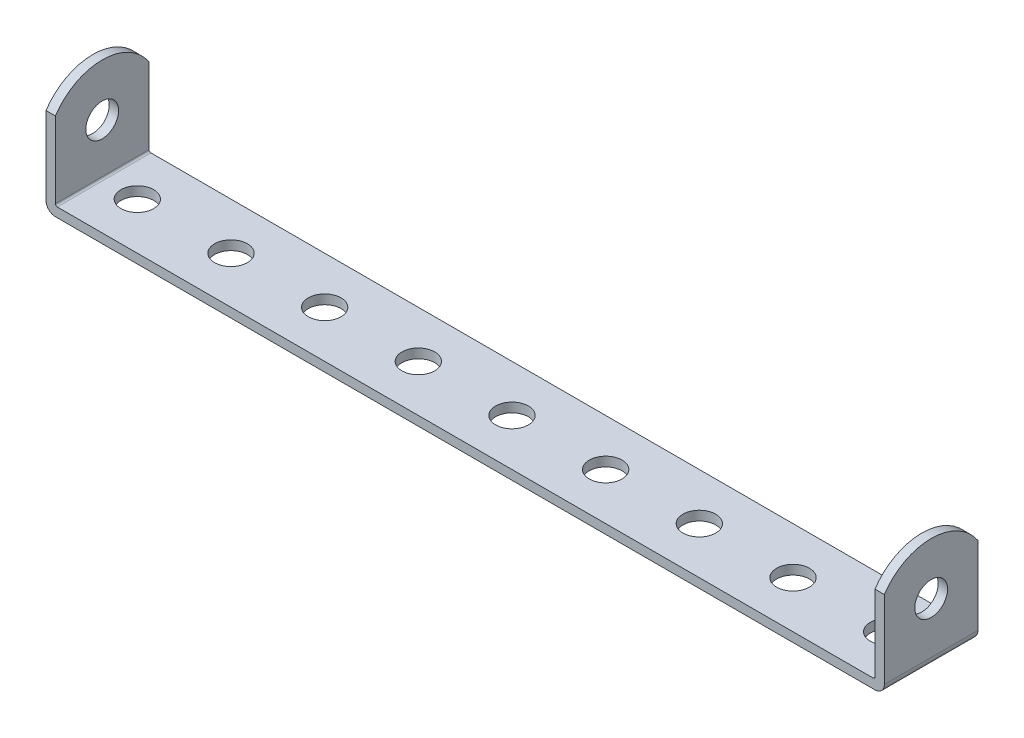
ISO-10303-21;
HEADER;
FILE_DESCRIPTION(('STEP AP214'),'2;1');
FILE_NAME('part.step','',(''),(''),'','','');
FILE_SCHEMA(('AUTOMOTIVE_DESIGN { 1 0 10303 214 1 1 1 1 }'));
ENDSEC;
DATA;
#1=APPLICATION_CONTEXT('core data for automotive mechanical design processes');
#2=APPLICATION_PROTOCOL_DEFINITION('international standard','automotive_design',2000,#1);
#3=PRODUCT_CONTEXT('',#1,'mechanical');
#4=PRODUCT('Part','Part','',(#3));
#5=PRODUCT_RELATED_PRODUCT_CATEGORY('part','',(#4));
#6=PRODUCT_DEFINITION_FORMATION('','',#4);
#7=PRODUCT_DEFINITION_CONTEXT('part definition',#1,'design');
#8=PRODUCT_DEFINITION('design','',#6,#7);
#9=PRODUCT_DEFINITION_SHAPE('','',#8);
#10=(LENGTH_UNIT() NAMED_UNIT(*) SI_UNIT(.MILLI.,.METRE.));
#11=(NAMED_UNIT(*) PLANE_ANGLE_UNIT() SI_UNIT($,.RADIAN.));
#12=(NAMED_UNIT(*) SI_UNIT($,.STERADIAN.) SOLID_ANGLE_UNIT());
#13=UNCERTAINTY_MEASURE_WITH_UNIT(LENGTH_MEASURE(1.E-05),#10,'distance_accuracy_value','');
#14=(GEOMETRIC_REPRESENTATION_CONTEXT(3) GLOBAL_UNCERTAINTY_ASSIGNED_CONTEXT((#13)) GLOBAL_UNIT_ASSIGNED_CONTEXT((#10,
#11,#12)) REPRESENTATION_CONTEXT('',''));
#15=CARTESIAN_POINT('',(0.,0.,0.));
#16=DIRECTION('',(0.,0.,1.));
#17=DIRECTION('',(1.,0.,0.));
#18=AXIS2_PLACEMENT_3D('',#15,#16,#17);
#19=CARTESIAN_POINT('',(6.03249999999999,1.27,6.35));
#20=DIRECTION('',(0.,-1.,0.));
#21=DIRECTION('',(0.,0.,-1.));
#22=AXIS2_PLACEMENT_3D('',#19,#20,#21);
#23=CYLINDRICAL_SURFACE('',#22,2.2225);
#24=CARTESIAN_POINT('',(6.03249999999999,0.,6.35));
#25=DIRECTION('',(0.,1.,0.));
#26=DIRECTION('',(1.,0.,0.));
#27=AXIS2_PLACEMENT_3D('',#24,#25,#26);
#28=CIRCLE('',#27,2.2225);
#29=CARTESIAN_POINT('',(8.25499999999999,0.,6.35));
#30=VERTEX_POINT('',#29);
#31=EDGE_CURVE('E201',#30,#30,#28,.T.);
#32=ORIENTED_EDGE('',*,*,#31,.F.);
#33=EDGE_LOOP('',(#32));
#34=FACE_BOUND('',#33,.T.);
#35=CARTESIAN_POINT('',(6.03249999999999,1.27,6.35));
#36=DIRECTION('',(0.,-1.,0.));
#37=DIRECTION('',(0.,0.,-1.));
#38=AXIS2_PLACEMENT_3D('',#35,#36,#37);
#39=CIRCLE('',#38,2.2225);
#40=CARTESIAN_POINT('',(6.03249999999999,1.27,4.1275));
#41=VERTEX_POINT('',#40);
#42=EDGE_CURVE('E195',#41,#41,#39,.T.);
#43=ORIENTED_EDGE('',*,*,#42,.F.);
#44=EDGE_LOOP('',(#43));
#45=FACE_BOUND('',#44,.T.);
#46=ADVANCED_FACE('F16',(#34,#45),#23,.F.);
#47=CARTESIAN_POINT('',(82.2325,1.27000000000001,6.35));
#48=DIRECTION('',(0.,-1.,0.));
#49=DIRECTION('',(0.,0.,-1.));
#50=AXIS2_PLACEMENT_3D('',#47,#48,#49);
#51=CYLINDRICAL_SURFACE('',#50,2.2225);
#52=CARTESIAN_POINT('',(82.2325,0.,6.35));
#53=DIRECTION('',(0.,1.,0.));
#54=DIRECTION('',(1.,0.,0.));
#55=AXIS2_PLACEMENT_3D('',#52,#53,#54);
#56=CIRCLE('',#55,2.2225);
#57=CARTESIAN_POINT('',(84.455,0.,6.35));
#58=VERTEX_POINT('',#57);
#59=EDGE_CURVE('E555',#58,#58,#56,.T.);
#60=ORIENTED_EDGE('',*,*,#59,.F.);
#61=EDGE_LOOP('',(#60));
#62=FACE_BOUND('',#61,.T.);
#63=CARTESIAN_POINT('',(82.2325,1.27,6.35));
#64=DIRECTION('',(0.,-1.,0.));
#65=DIRECTION('',(0.,0.,-1.));
#66=AXIS2_PLACEMENT_3D('',#63,#64,#65);
#67=CIRCLE('',#66,2.2225);
#68=CARTESIAN_POINT('',(82.2325,1.27,4.1275));
#69=VERTEX_POINT('',#68);
#70=EDGE_CURVE('E499',#69,#69,#67,.T.);
#71=ORIENTED_EDGE('',*,*,#70,.F.);
#72=EDGE_LOOP('',(#71));
#73=FACE_BOUND('',#72,.T.);
#74=ADVANCED_FACE('F270',(#62,#73),#51,.F.);
#75=CARTESIAN_POINT('',(18.7325,1.27,6.35));
#76=DIRECTION('',(0.,-1.,0.));
#77=DIRECTION('',(0.,0.,-1.));
#78=AXIS2_PLACEMENT_3D('',#75,#76,#77);
#79=CYLINDRICAL_SURFACE('',#78,2.2225);
#80=CARTESIAN_POINT('',(18.7325,0.,6.35));
#81=DIRECTION('',(0.,1.,0.));
#82=DIRECTION('',(1.,0.,0.));
#83=AXIS2_PLACEMENT_3D('',#80,#81,#82);
#84=CIRCLE('',#83,2.2225);
#85=CARTESIAN_POINT('',(20.955,0.,6.35));
#86=VERTEX_POINT('',#85);
#87=EDGE_CURVE('E551',#86,#86,#84,.T.);
#88=ORIENTED_EDGE('',*,*,#87,.F.);
#89=EDGE_LOOP('',(#88));
#90=FACE_BOUND('',#89,.T.);
#91=CARTESIAN_POINT('',(18.7325,1.27,6.35));
#92=DIRECTION('',(0.,-1.,0.));
#93=DIRECTION('',(0.,0.,-1.));
#94=AXIS2_PLACEMENT_3D('',#91,#92,#93);
#95=CIRCLE('',#94,2.2225);
#96=CARTESIAN_POINT('',(18.7325,1.27,4.1275));
#97=VERTEX_POINT('',#96);
#98=EDGE_CURVE('E503',#97,#97,#95,.T.);
#99=ORIENTED_EDGE('',*,*,#98,.F.);
#100=EDGE_LOOP('',(#99));
#101=FACE_BOUND('',#100,.T.);
#102=ADVANCED_FACE('F276',(#90,#101),#79,.F.);
#103=CARTESIAN_POINT('',(44.1325,1.27000000000001,6.35));
#104=DIRECTION('',(0.,-1.,0.));
#105=DIRECTION('',(0.,0.,-1.));
#106=AXIS2_PLACEMENT_3D('',#103,#104,#105);
#107=CYLINDRICAL_SURFACE('',#106,2.2225);
#108=CARTESIAN_POINT('',(44.1325,0.,6.35));
#109=DIRECTION('',(0.,1.,0.));
#110=DIRECTION('',(1.,0.,0.));
#111=AXIS2_PLACEMENT_3D('',#108,#109,#110);
#112=CIRCLE('',#111,2.2225);
#113=CARTESIAN_POINT('',(46.355,0.,6.35));
#114=VERTEX_POINT('',#113);
#115=EDGE_CURVE('E547',#114,#114,#112,.T.);
#116=ORIENTED_EDGE('',*,*,#115,.F.);
#117=EDGE_LOOP('',(#116));
#118=FACE_BOUND('',#117,.T.);
#119=CARTESIAN_POINT('',(44.1325,1.27,6.35));
#120=DIRECTION('',(0.,-1.,0.));
#121=DIRECTION('',(0.,0.,-1.));
#122=AXIS2_PLACEMENT_3D('',#119,#120,#121);
#123=CIRCLE('',#122,2.2225);
#124=CARTESIAN_POINT('',(44.1325,1.27,4.1275));
#125=VERTEX_POINT('',#124);
#126=EDGE_CURVE('E507',#125,#125,#123,.T.);
#127=ORIENTED_EDGE('',*,*,#126,.F.);
#128=EDGE_LOOP('',(#127));
#129=FACE_BOUND('',#128,.T.);
#130=ADVANCED_FACE('F285',(#118,#129),#107,.F.);
#131=CARTESIAN_POINT('',(56.8325,1.27000000000001,6.35));
#132=DIRECTION('',(0.,-1.,0.));
#133=DIRECTION('',(0.,0.,-1.));
#134=AXIS2_PLACEMENT_3D('',#131,#132,#133);
#135=CYLINDRICAL_SURFACE('',#134,2.2225);
#136=CARTESIAN_POINT('',(56.8325,0.,6.35));
#137=DIRECTION('',(0.,1.,0.));
#138=DIRECTION('',(1.,0.,0.));
#139=AXIS2_PLACEMENT_3D('',#136,#137,#138);
#140=CIRCLE('',#139,2.2225);
#141=CARTESIAN_POINT('',(59.055,0.,6.35));
#142=VERTEX_POINT('',#141);
#143=EDGE_CURVE('E543',#142,#142,#140,.T.);
#144=ORIENTED_EDGE('',*,*,#143,.F.);
#145=EDGE_LOOP('',(#144));
#146=FACE_BOUND('',#145,.T.);
#147=CARTESIAN_POINT('',(56.8325,1.27,6.35));
#148=DIRECTION('',(0.,-1.,0.));
#149=DIRECTION('',(0.,0.,-1.));
#150=AXIS2_PLACEMENT_3D('',#147,#148,#149);
#151=CIRCLE('',#150,2.2225);
#152=CARTESIAN_POINT('',(56.8325,1.27,4.1275));
#153=VERTEX_POINT('',#152);
#154=EDGE_CURVE('E511',#153,#153,#151,.T.);
#155=ORIENTED_EDGE('',*,*,#154,.F.);
#156=EDGE_LOOP('',(#155));
#157=FACE_BOUND('',#156,.T.);
#158=ADVANCED_FACE('F290',(#146,#157),#135,.F.);
#159=CARTESIAN_POINT('',(31.4325,1.27,6.35));
#160=DIRECTION('',(0.,-1.,0.));
#161=DIRECTION('',(0.,0.,-1.));
#162=AXIS2_PLACEMENT_3D('',#159,#160,#161);
#163=CYLINDRICAL_SURFACE('',#162,2.2225);
#164=CARTESIAN_POINT('',(31.4325,0.,6.35));
#165=DIRECTION('',(0.,1.,0.));
#166=DIRECTION('',(1.,0.,0.));
#167=AXIS2_PLACEMENT_3D('',#164,#165,#166);
#168=CIRCLE('',#167,2.2225);
#169=CARTESIAN_POINT('',(33.655,0.,6.35));
#170=VERTEX_POINT('',#169);
#171=EDGE_CURVE('E539',#170,#170,#168,.T.);
#172=ORIENTED_EDGE('',*,*,#171,.F.);
#173=EDGE_LOOP('',(#172));
#174=FACE_BOUND('',#173,.T.);
#175=CARTESIAN_POINT('',(31.4325,1.27,6.35));
#176=DIRECTION('',(0.,-1.,0.));
#177=DIRECTION('',(0.,0.,-1.));
#178=AXIS2_PLACEMENT_3D('',#175,#176,#177);
#179=CIRCLE('',#178,2.2225);
#180=CARTESIAN_POINT('',(31.4325,1.27,4.1275));
#181=VERTEX_POINT('',#180);
#182=EDGE_CURVE('E515',#181,#181,#179,.T.);
#183=ORIENTED_EDGE('',*,*,#182,.F.);
#184=EDGE_LOOP('',(#183));
#185=FACE_BOUND('',#184,.T.);
#186=ADVANCED_FACE('F294',(#174,#185),#163,.F.);
#187=CARTESIAN_POINT('',(69.5325,1.27000000000001,6.35));
#188=DIRECTION('',(0.,-1.,0.));
#189=DIRECTION('',(0.,0.,-1.));
#190=AXIS2_PLACEMENT_3D('',#187,#188,#189);
#191=CYLINDRICAL_SURFACE('',#190,2.2225);
#192=CARTESIAN_POINT('',(69.5325,0.,6.35));
#193=DIRECTION('',(0.,1.,0.));
#194=DIRECTION('',(1.,0.,0.));
#195=AXIS2_PLACEMENT_3D('',#192,#193,#194);
#196=CIRCLE('',#195,2.2225);
#197=CARTESIAN_POINT('',(71.755,0.,6.35));
#198=VERTEX_POINT('',#197);
#199=EDGE_CURVE('E535',#198,#198,#196,.T.);
#200=ORIENTED_EDGE('',*,*,#199,.F.);
#201=EDGE_LOOP('',(#200));
#202=FACE_BOUND('',#201,.T.);
#203=CARTESIAN_POINT('',(69.5325,1.27,6.35));
#204=DIRECTION('',(0.,-1.,0.));
#205=DIRECTION('',(0.,0.,-1.));
#206=AXIS2_PLACEMENT_3D('',#203,#204,#205);
#207=CIRCLE('',#206,2.2225);
#208=CARTESIAN_POINT('',(69.5325,1.27,4.1275));
#209=VERTEX_POINT('',#208);
#210=EDGE_CURVE('E519',#209,#209,#207,.T.);
#211=ORIENTED_EDGE('',*,*,#210,.F.);
#212=EDGE_LOOP('',(#211));
#213=FACE_BOUND('',#212,.T.);
#214=ADVANCED_FACE('F298',(#202,#213),#191,.F.);
#215=CARTESIAN_POINT('',(94.9325,1.27000000000001,6.35));
#216=DIRECTION('',(0.,-1.,0.));
#217=DIRECTION('',(0.,0.,-1.));
#218=AXIS2_PLACEMENT_3D('',#215,#216,#217);
#219=CYLINDRICAL_SURFACE('',#218,2.2225);
#220=CARTESIAN_POINT('',(94.9325,0.,6.35));
#221=DIRECTION('',(0.,1.,0.));
#222=DIRECTION('',(1.,0.,0.));
#223=AXIS2_PLACEMENT_3D('',#220,#221,#222);
#224=CIRCLE('',#223,2.2225);
#225=CARTESIAN_POINT('',(97.155,0.,6.35));
#226=VERTEX_POINT('',#225);
#227=EDGE_CURVE('E531',#226,#226,#224,.T.);
#228=ORIENTED_EDGE('',*,*,#227,.F.);
#229=EDGE_LOOP('',(#228));
#230=FACE_BOUND('',#229,.T.);
#231=CARTESIAN_POINT('',(94.9325,1.27,6.35));
#232=DIRECTION('',(0.,-1.,0.));
#233=DIRECTION('',(0.,0.,-1.));
#234=AXIS2_PLACEMENT_3D('',#231,#232,#233);
#235=CIRCLE('',#234,2.2225);
#236=CARTESIAN_POINT('',(94.9325,1.27,4.1275));
#237=VERTEX_POINT('',#236);
#238=EDGE_CURVE('E523',#237,#237,#235,.T.);
#239=ORIENTED_EDGE('',*,*,#238,.F.);
#240=EDGE_LOOP('',(#239));
#241=FACE_BOUND('',#240,.T.);
#242=ADVANCED_FACE('F302',(#230,#241),#219,.F.);
#243=CARTESIAN_POINT('',(107.6325,1.27000000000001,6.35));
#244=DIRECTION('',(0.,-1.,0.));
#245=DIRECTION('',(0.,0.,-1.));
#246=AXIS2_PLACEMENT_3D('',#243,#244,#245);
#247=CYLINDRICAL_SURFACE('',#246,2.2225);
#248=CARTESIAN_POINT('',(107.6325,0.,6.35));
#249=DIRECTION('',(0.,1.,0.));
#250=DIRECTION('',(1.,0.,0.));
#251=AXIS2_PLACEMENT_3D('',#248,#249,#250);
#252=CIRCLE('',#251,2.2225);
#253=CARTESIAN_POINT('',(109.855,0.,6.35));
#254=VERTEX_POINT('',#253);
#255=EDGE_CURVE('E186',#254,#254,#252,.T.);
#256=ORIENTED_EDGE('',*,*,#255,.F.);
#257=EDGE_LOOP('',(#256));
#258=FACE_BOUND('',#257,.T.);
#259=CARTESIAN_POINT('',(107.6325,1.27,6.35));
#260=DIRECTION('',(0.,-1.,0.));
#261=DIRECTION('',(0.,0.,-1.));
#262=AXIS2_PLACEMENT_3D('',#259,#260,#261);
#263=CIRCLE('',#262,2.2225);
#264=CARTESIAN_POINT('',(107.6325,1.27,4.1275));
#265=VERTEX_POINT('',#264);
#266=EDGE_CURVE('E171',#265,#265,#263,.T.);
#267=ORIENTED_EDGE('',*,*,#266,.F.);
#268=EDGE_LOOP('',(#267));
#269=FACE_BOUND('',#268,.T.);
#270=ADVANCED_FACE('F265',(#258,#269),#247,.F.);
#271=CARTESIAN_POINT('',(113.665,7.62000000000001,6.35));
#272=DIRECTION('',(-1.,0.,0.));
#273=DIRECTION('',(0.,0.,1.));
#274=AXIS2_PLACEMENT_3D('',#271,#272,#273);
#275=CYLINDRICAL_SURFACE('',#274,7.62);
#276=CARTESIAN_POINT('',(1.27000000000001,7.62000000000001,6.35));
#277=DIRECTION('',(1.,0.,0.));
#278=DIRECTION('',(0.,1.,0.));
#279=AXIS2_PLACEMENT_3D('',#276,#277,#278);
#280=CIRCLE('',#279,7.62);
#281=CARTESIAN_POINT('',(1.27000000000001,11.8321134837514,0.));
#282=VERTEX_POINT('',#281);
#283=CARTESIAN_POINT('',(1.27000000000001,11.8321134837514,12.7));
#284=VERTEX_POINT('',#283);
#285=EDGE_CURVE('E157',#282,#284,#280,.T.);
#286=ORIENTED_EDGE('',*,*,#285,.F.);
#287=DIRECTION('',(1.,0.,0.));
#288=VECTOR('',#287,1.);
#289=CARTESIAN_POINT('',(113.665,11.8321134837514,0.));
#290=LINE('',#289,#288);
#291=CARTESIAN_POINT('',(0.,11.8321134837514,0.));
#292=VERTEX_POINT('',#291);
#293=EDGE_CURVE('E35',#292,#282,#290,.T.);
#294=ORIENTED_EDGE('',*,*,#293,.F.);
#295=CARTESIAN_POINT('',(0.,7.62000000000001,6.35));
#296=DIRECTION('',(-1.,0.,0.));
#297=DIRECTION('',(0.,0.,1.));
#298=AXIS2_PLACEMENT_3D('',#295,#296,#297);
#299=CIRCLE('',#298,7.62);
#300=CARTESIAN_POINT('',(0.,11.8321134837514,12.7));
#301=VERTEX_POINT('',#300);
#302=EDGE_CURVE('E126',#301,#292,#299,.T.);
#303=ORIENTED_EDGE('',*,*,#302,.F.);
#304=DIRECTION('',(-1.,0.,0.));
#305=VECTOR('',#304,1.);
#306=CARTESIAN_POINT('',(113.665,11.8321134837514,12.7));
#307=LINE('',#306,#305);
#308=EDGE_CURVE('E26',#284,#301,#307,.T.);
#309=ORIENTED_EDGE('',*,*,#308,.F.);
#310=EDGE_LOOP('',(#286,#294,#303,#309));
#311=FACE_BOUND('',#310,.T.);
#312=ADVANCED_FACE('F237',(#311),#275,.T.);
#313=CARTESIAN_POINT('',(113.665,7.62000000000001,6.35));
#314=DIRECTION('',(-1.,0.,0.));
#315=DIRECTION('',(0.,0.,1.));
#316=AXIS2_PLACEMENT_3D('',#313,#314,#315);
#317=CYLINDRICAL_SURFACE('',#316,7.62);
#318=CARTESIAN_POINT('',(112.395,7.62000000000001,6.35));
#319=DIRECTION('',(-1.,0.,0.));
#320=DIRECTION('',(0.,0.,1.));
#321=AXIS2_PLACEMENT_3D('',#318,#319,#320);
#322=CIRCLE('',#321,7.62);
#323=CARTESIAN_POINT('',(112.395,11.8321134837514,12.7));
#324=VERTEX_POINT('',#323);
#325=CARTESIAN_POINT('',(112.395,11.8321134837514,0.));
#326=VERTEX_POINT('',#325);
#327=EDGE_CURVE('E135',#324,#326,#322,.T.);
#328=ORIENTED_EDGE('',*,*,#327,.F.);
#329=DIRECTION('',(-1.,0.,0.));
#330=VECTOR('',#329,1.);
#331=CARTESIAN_POINT('',(113.665,11.8321134837514,12.7));
#332=LINE('',#331,#330);
#333=CARTESIAN_POINT('',(113.665,11.8321134837514,12.7));
#334=VERTEX_POINT('',#333);
#335=EDGE_CURVE('E11',#334,#324,#332,.T.);
#336=ORIENTED_EDGE('',*,*,#335,.F.);
#337=CARTESIAN_POINT('',(113.665,7.62000000000001,6.35));
#338=DIRECTION('',(1.,0.,0.));
#339=DIRECTION('',(0.,1.,0.));
#340=AXIS2_PLACEMENT_3D('',#337,#338,#339);
#341=CIRCLE('',#340,7.62);
#342=CARTESIAN_POINT('',(113.665,11.8321134837514,0.));
#343=VERTEX_POINT('',#342);
#344=EDGE_CURVE('E140',#343,#334,#341,.T.);
#345=ORIENTED_EDGE('',*,*,#344,.F.);
#346=DIRECTION('',(1.,0.,0.));
#347=VECTOR('',#346,1.);
#348=CARTESIAN_POINT('',(113.665,11.8321134837514,0.));
#349=LINE('',#348,#347);
#350=EDGE_CURVE('E144',#326,#343,#349,.T.);
#351=ORIENTED_EDGE('',*,*,#350,.F.);
#352=EDGE_LOOP('',(#328,#336,#345,#351));
#353=FACE_BOUND('',#352,.T.);
#354=ADVANCED_FACE('F253',(#353),#317,.T.);
#355=CARTESIAN_POINT('',(113.665,8.19150000000002,6.35));
#356=DIRECTION('',(-1.,0.,0.));
#357=DIRECTION('',(0.,0.,1.));
#358=AXIS2_PLACEMENT_3D('',#355,#356,#357);
#359=CYLINDRICAL_SURFACE('',#358,2.2225);
#360=CARTESIAN_POINT('',(113.665,8.19150000000002,6.35));
#361=DIRECTION('',(-1.,0.,0.));
#362=DIRECTION('',(0.,0.,1.));
#363=AXIS2_PLACEMENT_3D('',#360,#361,#362);
#364=CIRCLE('',#363,2.2225);
#365=CARTESIAN_POINT('',(113.665,8.19150000000002,8.5725));
#366=VERTEX_POINT('',#365);
#367=EDGE_CURVE('E142',#366,#366,#364,.T.);
#368=ORIENTED_EDGE('',*,*,#367,.F.);
#369=EDGE_LOOP('',(#368));
#370=FACE_BOUND('',#369,.T.);
#371=CARTESIAN_POINT('',(112.395,8.19150000000002,6.35));
#372=DIRECTION('',(1.,0.,0.));
#373=DIRECTION('',(0.,1.,0.));
#374=AXIS2_PLACEMENT_3D('',#371,#372,#373);
#375=CIRCLE('',#374,2.2225);
#376=CARTESIAN_POINT('',(112.395,10.414,6.35));
#377=VERTEX_POINT('',#376);
#378=EDGE_CURVE('E150',#377,#377,#375,.T.);
#379=ORIENTED_EDGE('',*,*,#378,.F.);
#380=EDGE_LOOP('',(#379));
#381=FACE_BOUND('',#380,.T.);
#382=ADVANCED_FACE('F255',(#370,#381),#359,.F.);
#383=CARTESIAN_POINT('',(113.665,8.19150000000002,6.35));
#384=DIRECTION('',(-1.,0.,0.));
#385=DIRECTION('',(0.,0.,1.));
#386=AXIS2_PLACEMENT_3D('',#383,#384,#385);
#387=CYLINDRICAL_SURFACE('',#386,2.2225);
#388=CARTESIAN_POINT('',(1.27000000000001,8.19150000000002,6.35));
#389=DIRECTION('',(-1.,0.,0.));
#390=DIRECTION('',(0.,1.,0.));
#391=AXIS2_PLACEMENT_3D('',#388,#389,#390);
#392=CIRCLE('',#391,2.2225);
#393=CARTESIAN_POINT('',(1.27000000000001,10.414,6.35));
#394=VERTEX_POINT('',#393);
#395=EDGE_CURVE('E134',#394,#394,#392,.T.);
#396=ORIENTED_EDGE('',*,*,#395,.F.);
#397=EDGE_LOOP('',(#396));
#398=FACE_BOUND('',#397,.T.);
#399=CARTESIAN_POINT('',(0.,8.19150000000002,6.35));
#400=DIRECTION('',(1.,0.,0.));
#401=DIRECTION('',(0.,1.,0.));
#402=AXIS2_PLACEMENT_3D('',#399,#400,#401);
#403=CIRCLE('',#402,2.2225);
#404=CARTESIAN_POINT('',(0.,10.414,6.35));
#405=VERTEX_POINT('',#404);
#406=EDGE_CURVE('E146',#405,#405,#403,.T.);
#407=ORIENTED_EDGE('',*,*,#406,.F.);
#408=EDGE_LOOP('',(#407));
#409=FACE_BOUND('',#408,.T.);
#410=ADVANCED_FACE('F262',(#398,#409),#387,.F.);
#411=CARTESIAN_POINT('',(56.8325,2.25976986334896,12.7));
#412=DIRECTION('',(0.,0.,1.));
#413=DIRECTION('',(1.,0.,0.));
#414=AXIS2_PLACEMENT_3D('',#411,#412,#413);
#415=PLANE('',#414);
#416=ORIENTED_EDGE('',*,*,#335,.T.);
#417=DIRECTION('',(0.,1.,0.));
#418=VECTOR('',#417,1.);
#419=CARTESIAN_POINT('',(112.395,15.24,12.7));
#420=LINE('',#419,#418);
#421=CARTESIAN_POINT('',(112.395,1.52400000000001,12.7));
#422=VERTEX_POINT('',#421);
#423=EDGE_CURVE('E153',#422,#324,#420,.T.);
#424=ORIENTED_EDGE('',*,*,#423,.F.);
#425=CARTESIAN_POINT('',(112.141,1.52400000000001,12.7));
#426=DIRECTION('',(0.,0.,1.));
#427=DIRECTION('',(1.,0.,0.));
#428=AXIS2_PLACEMENT_3D('',#425,#426,#427);
#429=CIRCLE('',#428,0.254);
#430=CARTESIAN_POINT('',(112.141,1.27000000000001,12.7));
#431=VERTEX_POINT('',#430);
#432=EDGE_CURVE('E163',#431,#422,#429,.T.);
#433=ORIENTED_EDGE('',*,*,#432,.F.);
#434=DIRECTION('',(1.,0.,0.));
#435=VECTOR('',#434,1.);
#436=CARTESIAN_POINT('',(112.141,1.27000000000001,12.7));
#437=LINE('',#436,#435);
#438=CARTESIAN_POINT('',(1.524,1.27,12.7));
#439=VERTEX_POINT('',#438);
#440=EDGE_CURVE('E168',#439,#431,#437,.T.);
#441=ORIENTED_EDGE('',*,*,#440,.F.);
#442=CARTESIAN_POINT('',(1.524,1.524,12.7));
#443=DIRECTION('',(0.,0.,1.));
#444=DIRECTION('',(1.,0.,0.));
#445=AXIS2_PLACEMENT_3D('',#442,#443,#444);
#446=CIRCLE('',#445,0.254);
#447=CARTESIAN_POINT('',(1.27,1.524,12.7));
#448=VERTEX_POINT('',#447);
#449=EDGE_CURVE('E173',#448,#439,#446,.T.);
#450=ORIENTED_EDGE('',*,*,#449,.F.);
#451=DIRECTION('',(0.,-1.,0.));
#452=VECTOR('',#451,1.);
#453=CARTESIAN_POINT('',(1.27,1.524,12.7));
#454=LINE('',#453,#452);
#455=EDGE_CURVE('E178',#284,#448,#454,.T.);
#456=ORIENTED_EDGE('',*,*,#455,.F.);
#457=ORIENTED_EDGE('',*,*,#308,.T.);
#458=DIRECTION('',(0.,1.,0.));
#459=VECTOR('',#458,1.);
#460=CARTESIAN_POINT('',(0.,15.24,12.7));
#461=LINE('',#460,#459);
#462=CARTESIAN_POINT('',(0.,1.27,12.7));
#463=VERTEX_POINT('',#462);
#464=EDGE_CURVE('E118',#463,#301,#461,.T.);
#465=ORIENTED_EDGE('',*,*,#464,.F.);
#466=CARTESIAN_POINT('',(1.27,1.27,12.7));
#467=DIRECTION('',(0.,0.,-1.));
#468=DIRECTION('',(0.,-1.,0.));
#469=AXIS2_PLACEMENT_3D('',#466,#467,#468);
#470=CIRCLE('',#469,1.27);
#471=CARTESIAN_POINT('',(1.27,0.,12.7));
#472=VERTEX_POINT('',#471);
#473=EDGE_CURVE('E114',#472,#463,#470,.T.);
#474=ORIENTED_EDGE('',*,*,#473,.F.);
#475=DIRECTION('',(-1.,0.,0.));
#476=VECTOR('',#475,1.);
#477=CARTESIAN_POINT('',(1.27000000000001,0.,12.7));
#478=LINE('',#477,#476);
#479=CARTESIAN_POINT('',(112.395,0.,12.7));
#480=VERTEX_POINT('',#479);
#481=EDGE_CURVE('E184',#480,#472,#478,.T.);
#482=ORIENTED_EDGE('',*,*,#481,.F.);
#483=CARTESIAN_POINT('',(112.395,1.27000000000002,12.7));
#484=DIRECTION('',(0.,0.,-1.));
#485=DIRECTION('',(0.,-1.,0.));
#486=AXIS2_PLACEMENT_3D('',#483,#484,#485);
#487=CIRCLE('',#486,1.27);
#488=CARTESIAN_POINT('',(113.665,1.27000000000002,12.7));
#489=VERTEX_POINT('',#488);
#490=EDGE_CURVE('E154',#489,#480,#487,.T.);
#491=ORIENTED_EDGE('',*,*,#490,.F.);
#492=DIRECTION('',(0.,-1.,0.));
#493=VECTOR('',#492,1.);
#494=CARTESIAN_POINT('',(113.665,1.27000000000002,12.7));
#495=LINE('',#494,#493);
#496=EDGE_CURVE('E143',#334,#489,#495,.T.);
#497=ORIENTED_EDGE('',*,*,#496,.F.);
#498=EDGE_LOOP('',(#416,#424,#433,#441,#450,#456,#457,#465,#474,#482,#491,#497));
#499=FACE_BOUND('',#498,.T.);
#500=ADVANCED_FACE('F233',(#499),#415,.T.);
#501=CARTESIAN_POINT('',(1.27,15.24,0.));
#502=DIRECTION('',(1.,0.,0.));
#503=DIRECTION('',(0.,1.,0.));
#504=AXIS2_PLACEMENT_3D('',#501,#502,#503);
#505=PLANE('',#504);
#506=ORIENTED_EDGE('',*,*,#395,.T.);
#507=EDGE_LOOP('',(#506));
#508=FACE_BOUND('',#507,.T.);
#509=ORIENTED_EDGE('',*,*,#285,.T.);
#510=ORIENTED_EDGE('',*,*,#455,.T.);
#511=DIRECTION('',(0.,0.,1.));
#512=VECTOR('',#511,1.);
#513=CARTESIAN_POINT('',(1.27,1.524,0.));
#514=LINE('',#513,#512);
#515=CARTESIAN_POINT('',(1.27,1.524,0.));
#516=VERTEX_POINT('',#515);
#517=EDGE_CURVE('E192',#516,#448,#514,.T.);
#518=ORIENTED_EDGE('',*,*,#517,.F.);
#519=DIRECTION('',(0.,1.,0.));
#520=VECTOR('',#519,1.);
#521=CARTESIAN_POINT('',(1.27,1.524,0.));
#522=LINE('',#521,#520);
#523=EDGE_CURVE('E149',#516,#282,#522,.T.);
#524=ORIENTED_EDGE('',*,*,#523,.T.);
#525=EDGE_LOOP('',(#509,#510,#518,#524));
#526=FACE_BOUND('',#525,.T.);
#527=ADVANCED_FACE('F239',(#508,#526),#505,.T.);
#528=CARTESIAN_POINT('',(113.665,15.24,0.));
#529=DIRECTION('',(1.,0.,0.));
#530=DIRECTION('',(0.,0.,-1.));
#531=AXIS2_PLACEMENT_3D('',#528,#529,#530);
#532=PLANE('',#531);
#533=ORIENTED_EDGE('',*,*,#367,.T.);
#534=EDGE_LOOP('',(#533));
#535=FACE_BOUND('',#534,.T.);
#536=ORIENTED_EDGE('',*,*,#344,.T.);
#537=ORIENTED_EDGE('',*,*,#496,.T.);
#538=DIRECTION('',(0.,0.,1.));
#539=VECTOR('',#538,1.);
#540=CARTESIAN_POINT('',(113.665,1.27000000000002,0.));
#541=LINE('',#540,#539);
#542=CARTESIAN_POINT('',(113.665,1.27000000000002,0.));
#543=VERTEX_POINT('',#542);
#544=EDGE_CURVE('E198',#543,#489,#541,.T.);
#545=ORIENTED_EDGE('',*,*,#544,.F.);
#546=DIRECTION('',(0.,1.,0.));
#547=VECTOR('',#546,1.);
#548=CARTESIAN_POINT('',(113.665,1.27000000000002,0.));
#549=LINE('',#548,#547);
#550=EDGE_CURVE('E176',#543,#343,#549,.T.);
#551=ORIENTED_EDGE('',*,*,#550,.T.);
#552=EDGE_LOOP('',(#536,#537,#545,#551));
#553=FACE_BOUND('',#552,.T.);
#554=ADVANCED_FACE('F229',(#535,#553),#532,.T.);
#555=CARTESIAN_POINT('',(1.524,1.524,0.));
#556=DIRECTION('',(0.,0.,1.));
#557=DIRECTION('',(1.,0.,0.));
#558=AXIS2_PLACEMENT_3D('',#555,#556,#557);
#559=CYLINDRICAL_SURFACE('',#558,0.254);
#560=ORIENTED_EDGE('',*,*,#449,.T.);
#561=DIRECTION('',(0.,0.,1.));
#562=VECTOR('',#561,1.);
#563=CARTESIAN_POINT('',(1.524,1.27,0.));
#564=LINE('',#563,#562);
#565=CARTESIAN_POINT('',(1.524,1.27,0.));
#566=VERTEX_POINT('',#565);
#567=EDGE_CURVE('E166',#566,#439,#564,.T.);
#568=ORIENTED_EDGE('',*,*,#567,.F.);
#569=CARTESIAN_POINT('',(1.524,1.524,0.));
#570=DIRECTION('',(0.,0.,-1.));
#571=DIRECTION('',(0.,-1.,0.));
#572=AXIS2_PLACEMENT_3D('',#569,#570,#571);
#573=CIRCLE('',#572,0.254);
#574=EDGE_CURVE('E177',#566,#516,#573,.T.);
#575=ORIENTED_EDGE('',*,*,#574,.T.);
#576=ORIENTED_EDGE('',*,*,#517,.T.);
#577=EDGE_LOOP('',(#560,#568,#575,#576));
#578=FACE_BOUND('',#577,.T.);
#579=ADVANCED_FACE('F243',(#578),#559,.F.);
#580=CARTESIAN_POINT('',(1.524,1.27,0.));
#581=DIRECTION('',(0.,1.,0.));
#582=DIRECTION('',(-1.,0.,0.));
#583=AXIS2_PLACEMENT_3D('',#580,#581,#582);
#584=PLANE('',#583);
#585=ORIENTED_EDGE('',*,*,#42,.T.);
#586=EDGE_LOOP('',(#585));
#587=FACE_BOUND('',#586,.T.);
#588=ORIENTED_EDGE('',*,*,#70,.T.);
#589=EDGE_LOOP('',(#588));
#590=FACE_BOUND('',#589,.T.);
#591=ORIENTED_EDGE('',*,*,#98,.T.);
#592=EDGE_LOOP('',(#591));
#593=FACE_BOUND('',#592,.T.);
#594=ORIENTED_EDGE('',*,*,#126,.T.);
#595=EDGE_LOOP('',(#594));
#596=FACE_BOUND('',#595,.T.);
#597=ORIENTED_EDGE('',*,*,#154,.T.);
#598=EDGE_LOOP('',(#597));
#599=FACE_BOUND('',#598,.T.);
#600=ORIENTED_EDGE('',*,*,#182,.T.);
#601=EDGE_LOOP('',(#600));
#602=FACE_BOUND('',#601,.T.);
#603=ORIENTED_EDGE('',*,*,#210,.T.);
#604=EDGE_LOOP('',(#603));
#605=FACE_BOUND('',#604,.T.);
#606=ORIENTED_EDGE('',*,*,#238,.T.);
#607=EDGE_LOOP('',(#606));
#608=FACE_BOUND('',#607,.T.);
#609=ORIENTED_EDGE('',*,*,#266,.T.);
#610=EDGE_LOOP('',(#609));
#611=FACE_BOUND('',#610,.T.);
#612=ORIENTED_EDGE('',*,*,#440,.T.);
#613=DIRECTION('',(0.,0.,1.));
#614=VECTOR('',#613,1.);
#615=CARTESIAN_POINT('',(112.141,1.27000000000001,0.));
#616=LINE('',#615,#614);
#617=CARTESIAN_POINT('',(112.141,1.27000000000001,0.));
#618=VERTEX_POINT('',#617);
#619=EDGE_CURVE('E137',#618,#431,#616,.T.);
#620=ORIENTED_EDGE('',*,*,#619,.F.);
#621=DIRECTION('',(-1.,0.,0.));
#622=VECTOR('',#621,1.);
#623=CARTESIAN_POINT('',(112.141,1.27000000000001,0.));
#624=LINE('',#623,#622);
#625=EDGE_CURVE('E172',#618,#566,#624,.T.);
#626=ORIENTED_EDGE('',*,*,#625,.T.);
#627=ORIENTED_EDGE('',*,*,#567,.T.);
#628=EDGE_LOOP('',(#612,#620,#626,#627));
#629=FACE_BOUND('',#628,.T.);
#630=ADVANCED_FACE('F245',(#587,#590,#593,#596,#599,#602,#605,#608,#611,#629),#584,.T.);
#631=CARTESIAN_POINT('',(112.141,1.52400000000001,0.));
#632=DIRECTION('',(0.,0.,1.));
#633=DIRECTION('',(1.,0.,0.));
#634=AXIS2_PLACEMENT_3D('',#631,#632,#633);
#635=CYLINDRICAL_SURFACE('',#634,0.254);
#636=ORIENTED_EDGE('',*,*,#432,.T.);
#637=DIRECTION('',(0.,0.,1.));
#638=VECTOR('',#637,1.);
#639=CARTESIAN_POINT('',(112.395,1.52400000000001,0.));
#640=LINE('',#639,#638);
#641=CARTESIAN_POINT('',(112.395,1.52400000000001,0.));
#642=VERTEX_POINT('',#641);
#643=EDGE_CURVE('E162',#642,#422,#640,.T.);
#644=ORIENTED_EDGE('',*,*,#643,.F.);
#645=CARTESIAN_POINT('',(112.141,1.52400000000001,0.));
#646=DIRECTION('',(0.,0.,-1.));
#647=DIRECTION('',(0.,-1.,0.));
#648=AXIS2_PLACEMENT_3D('',#645,#646,#647);
#649=CIRCLE('',#648,0.254);
#650=EDGE_CURVE('E167',#642,#618,#649,.T.);
#651=ORIENTED_EDGE('',*,*,#650,.T.);
#652=ORIENTED_EDGE('',*,*,#619,.T.);
#653=EDGE_LOOP('',(#636,#644,#651,#652));
#654=FACE_BOUND('',#653,.T.);
#655=ADVANCED_FACE('F248',(#654),#635,.F.);
#656=CARTESIAN_POINT('',(112.395,1.52400000000001,0.));
#657=DIRECTION('',(-1.,0.,0.));
#658=DIRECTION('',(0.,0.,1.));
#659=AXIS2_PLACEMENT_3D('',#656,#657,#658);
#660=PLANE('',#659);
#661=ORIENTED_EDGE('',*,*,#327,.T.);
#662=DIRECTION('',(0.,-1.,0.));
#663=VECTOR('',#662,1.);
#664=CARTESIAN_POINT('',(112.395,15.24,0.));
#665=LINE('',#664,#663);
#666=EDGE_CURVE('E138',#326,#642,#665,.T.);
#667=ORIENTED_EDGE('',*,*,#666,.T.);
#668=ORIENTED_EDGE('',*,*,#643,.T.);
#669=ORIENTED_EDGE('',*,*,#423,.T.);
#670=EDGE_LOOP('',(#661,#667,#668,#669));
#671=FACE_BOUND('',#670,.T.);
#672=ORIENTED_EDGE('',*,*,#378,.T.);
#673=EDGE_LOOP('',(#672));
#674=FACE_BOUND('',#673,.T.);
#675=ADVANCED_FACE('F250',(#671,#674),#660,.T.);
#676=CARTESIAN_POINT('',(112.395,1.27000000000002,0.));
#677=DIRECTION('',(0.,0.,1.));
#678=DIRECTION('',(1.,0.,0.));
#679=AXIS2_PLACEMENT_3D('',#676,#677,#678);
#680=CYLINDRICAL_SURFACE('',#679,1.27);
#681=ORIENTED_EDGE('',*,*,#490,.T.);
#682=DIRECTION('',(0.,0.,1.));
#683=VECTOR('',#682,1.);
#684=CARTESIAN_POINT('',(112.395,0.,0.));
#685=LINE('',#684,#683);
#686=CARTESIAN_POINT('',(112.395,0.,0.));
#687=VERTEX_POINT('',#686);
#688=EDGE_CURVE('E183',#687,#480,#685,.T.);
#689=ORIENTED_EDGE('',*,*,#688,.F.);
#690=CARTESIAN_POINT('',(112.395,1.27000000000002,0.));
#691=DIRECTION('',(0.,0.,1.));
#692=DIRECTION('',(1.,0.,0.));
#693=AXIS2_PLACEMENT_3D('',#690,#691,#692);
#694=CIRCLE('',#693,1.27);
#695=EDGE_CURVE('E189',#687,#543,#694,.T.);
#696=ORIENTED_EDGE('',*,*,#695,.T.);
#697=ORIENTED_EDGE('',*,*,#544,.T.);
#698=EDGE_LOOP('',(#681,#689,#696,#697));
#699=FACE_BOUND('',#698,.T.);
#700=ADVANCED_FACE('F224',(#699),#680,.T.);
#701=CARTESIAN_POINT('',(112.395,0.,0.));
#702=DIRECTION('',(0.,-1.,0.));
#703=DIRECTION('',(1.,0.,0.));
#704=AXIS2_PLACEMENT_3D('',#701,#702,#703);
#705=PLANE('',#704);
#706=ORIENTED_EDGE('',*,*,#31,.T.);
#707=EDGE_LOOP('',(#706));
#708=FACE_BOUND('',#707,.T.);
#709=ORIENTED_EDGE('',*,*,#59,.T.);
#710=EDGE_LOOP('',(#709));
#711=FACE_BOUND('',#710,.T.);
#712=ORIENTED_EDGE('',*,*,#87,.T.);
#713=EDGE_LOOP('',(#712));
#714=FACE_BOUND('',#713,.T.);
#715=ORIENTED_EDGE('',*,*,#115,.T.);
#716=EDGE_LOOP('',(#715));
#717=FACE_BOUND('',#716,.T.);
#718=ORIENTED_EDGE('',*,*,#143,.T.);
#719=EDGE_LOOP('',(#718));
#720=FACE_BOUND('',#719,.T.);
#721=ORIENTED_EDGE('',*,*,#171,.T.);
#722=EDGE_LOOP('',(#721));
#723=FACE_BOUND('',#722,.T.);
#724=ORIENTED_EDGE('',*,*,#199,.T.);
#725=EDGE_LOOP('',(#724));
#726=FACE_BOUND('',#725,.T.);
#727=ORIENTED_EDGE('',*,*,#227,.T.);
#728=EDGE_LOOP('',(#727));
#729=FACE_BOUND('',#728,.T.);
#730=ORIENTED_EDGE('',*,*,#255,.T.);
#731=EDGE_LOOP('',(#730));
#732=FACE_BOUND('',#731,.T.);
#733=ORIENTED_EDGE('',*,*,#481,.T.);
#734=DIRECTION('',(0.,0.,1.));
#735=VECTOR('',#734,1.);
#736=CARTESIAN_POINT('',(1.27,0.,0.));
#737=LINE('',#736,#735);
#738=CARTESIAN_POINT('',(1.27,0.,0.));
#739=VERTEX_POINT('',#738);
#740=EDGE_CURVE('E104',#739,#472,#737,.T.);
#741=ORIENTED_EDGE('',*,*,#740,.F.);
#742=DIRECTION('',(1.,0.,0.));
#743=VECTOR('',#742,1.);
#744=CARTESIAN_POINT('',(1.27000000000001,0.,0.));
#745=LINE('',#744,#743);
#746=EDGE_CURVE('E122',#739,#687,#745,.T.);
#747=ORIENTED_EDGE('',*,*,#746,.T.);
#748=ORIENTED_EDGE('',*,*,#688,.T.);
#749=EDGE_LOOP('',(#733,#741,#747,#748));
#750=FACE_BOUND('',#749,.T.);
#751=ADVANCED_FACE('F222',(#708,#711,#714,#717,#720,#723,#726,#729,#732,#750),#705,.T.);
#752=CARTESIAN_POINT('',(1.27,1.27,0.));
#753=DIRECTION('',(0.,0.,1.));
#754=DIRECTION('',(1.,0.,0.));
#755=AXIS2_PLACEMENT_3D('',#752,#753,#754);
#756=CYLINDRICAL_SURFACE('',#755,1.27);
#757=ORIENTED_EDGE('',*,*,#473,.T.);
#758=DIRECTION('',(0.,0.,1.));
#759=VECTOR('',#758,1.);
#760=CARTESIAN_POINT('',(0.,1.27,0.));
#761=LINE('',#760,#759);
#762=CARTESIAN_POINT('',(0.,1.27,0.));
#763=VERTEX_POINT('',#762);
#764=EDGE_CURVE('E111',#763,#463,#761,.T.);
#765=ORIENTED_EDGE('',*,*,#764,.F.);
#766=CARTESIAN_POINT('',(1.27,1.27,0.));
#767=DIRECTION('',(0.,0.,1.));
#768=DIRECTION('',(1.,0.,0.));
#769=AXIS2_PLACEMENT_3D('',#766,#767,#768);
#770=CIRCLE('',#769,1.27);
#771=EDGE_CURVE('E113',#763,#739,#770,.T.);
#772=ORIENTED_EDGE('',*,*,#771,.T.);
#773=ORIENTED_EDGE('',*,*,#740,.T.);
#774=EDGE_LOOP('',(#757,#765,#772,#773));
#775=FACE_BOUND('',#774,.T.);
#776=ADVANCED_FACE('F18',(#775),#756,.T.);
#777=CARTESIAN_POINT('',(0.,1.27,0.));
#778=DIRECTION('',(-1.,0.,0.));
#779=DIRECTION('',(0.,0.,1.));
#780=AXIS2_PLACEMENT_3D('',#777,#778,#779);
#781=PLANE('',#780);
#782=ORIENTED_EDGE('',*,*,#302,.T.);
#783=DIRECTION('',(0.,-1.,0.));
#784=VECTOR('',#783,1.);
#785=CARTESIAN_POINT('',(0.,15.24,0.));
#786=LINE('',#785,#784);
#787=EDGE_CURVE('E20',#292,#763,#786,.T.);
#788=ORIENTED_EDGE('',*,*,#787,.T.);
#789=ORIENTED_EDGE('',*,*,#764,.T.);
#790=ORIENTED_EDGE('',*,*,#464,.T.);
#791=EDGE_LOOP('',(#782,#788,#789,#790));
#792=FACE_BOUND('',#791,.T.);
#793=ORIENTED_EDGE('',*,*,#406,.T.);
#794=EDGE_LOOP('',(#793));
#795=FACE_BOUND('',#794,.T.);
#796=ADVANCED_FACE('F124',(#792,#795),#781,.T.);
#797=CARTESIAN_POINT('',(56.8325,2.25976986334896,0.));
#798=DIRECTION('',(0.,0.,1.));
#799=DIRECTION('',(1.,0.,0.));
#800=AXIS2_PLACEMENT_3D('',#797,#798,#799);
#801=PLANE('',#800);
#802=ORIENTED_EDGE('',*,*,#350,.T.);
#803=ORIENTED_EDGE('',*,*,#550,.F.);
#804=ORIENTED_EDGE('',*,*,#695,.F.);
#805=ORIENTED_EDGE('',*,*,#746,.F.);
#806=ORIENTED_EDGE('',*,*,#771,.F.);
#807=ORIENTED_EDGE('',*,*,#787,.F.);
#808=ORIENTED_EDGE('',*,*,#293,.T.);
#809=ORIENTED_EDGE('',*,*,#523,.F.);
#810=ORIENTED_EDGE('',*,*,#574,.F.);
#811=ORIENTED_EDGE('',*,*,#625,.F.);
#812=ORIENTED_EDGE('',*,*,#650,.F.);
#813=ORIENTED_EDGE('',*,*,#666,.F.);
#814=EDGE_LOOP('',(#802,#803,#804,#805,#806,#807,#808,#809,#810,#811,#812,#813));
#815=FACE_BOUND('',#814,.T.);
#816=ADVANCED_FACE('F120',(#815),#801,.F.);
#817=CLOSED_SHELL('',(#46,#74,#102,#130,#158,#186,#214,#242,#270,#312,#354,#382,#410,#500,#527,
#554,#579,#630,#655,#675,#700,#751,#776,#796,#816));
#818=MANIFOLD_SOLID_BREP('B1',#817);
#819=ADVANCED_BREP_SHAPE_REPRESENTATION('',(#18,#818),#14);
#820=SHAPE_DEFINITION_REPRESENTATION(#9,#819);
ENDSEC;
END-ISO-10303-21;
